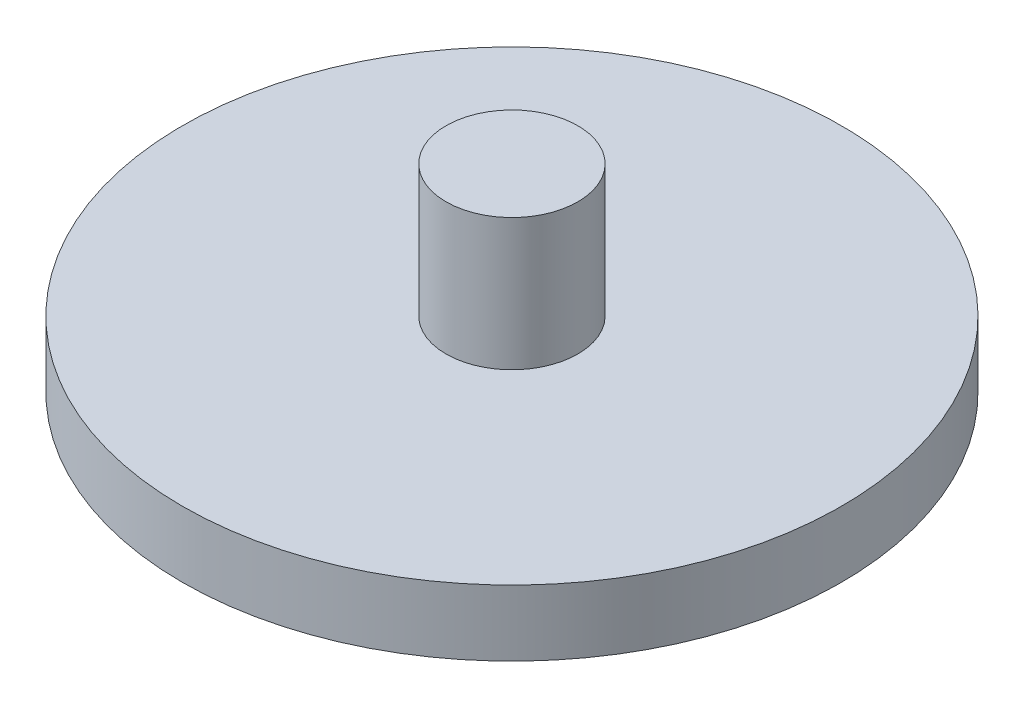
ISO-10303-21;
HEADER;
FILE_DESCRIPTION(('STEP AP214'),'2;1');
FILE_NAME('part.step','',(''),(''),'','','');
FILE_SCHEMA(('AUTOMOTIVE_DESIGN { 1 0 10303 214 1 1 1 1 }'));
ENDSEC;
DATA;
#1=APPLICATION_CONTEXT('core data for automotive mechanical design processes');
#2=APPLICATION_PROTOCOL_DEFINITION('international standard','automotive_design',2000,#1);
#3=PRODUCT_CONTEXT('',#1,'mechanical');
#4=PRODUCT('Part','Part','',(#3));
#5=PRODUCT_RELATED_PRODUCT_CATEGORY('part','',(#4));
#6=PRODUCT_DEFINITION_FORMATION('','',#4);
#7=PRODUCT_DEFINITION_CONTEXT('part definition',#1,'design');
#8=PRODUCT_DEFINITION('design','',#6,#7);
#9=PRODUCT_DEFINITION_SHAPE('','',#8);
#10=(LENGTH_UNIT() NAMED_UNIT(*) SI_UNIT(.MILLI.,.METRE.));
#11=(NAMED_UNIT(*) PLANE_ANGLE_UNIT() SI_UNIT($,.RADIAN.));
#12=(NAMED_UNIT(*) SI_UNIT($,.STERADIAN.) SOLID_ANGLE_UNIT());
#13=UNCERTAINTY_MEASURE_WITH_UNIT(LENGTH_MEASURE(1.E-05),#10,'distance_accuracy_value','');
#14=(GEOMETRIC_REPRESENTATION_CONTEXT(3) GLOBAL_UNCERTAINTY_ASSIGNED_CONTEXT((#13)) GLOBAL_UNIT_ASSIGNED_CONTEXT((#10,
#11,#12)) REPRESENTATION_CONTEXT('',''));
#15=CARTESIAN_POINT('',(0.,0.,0.));
#16=DIRECTION('',(0.,0.,1.));
#17=DIRECTION('',(1.,0.,0.));
#18=AXIS2_PLACEMENT_3D('',#15,#16,#17);
#19=CARTESIAN_POINT('',(0.,10.,0.));
#20=DIRECTION('',(0.,-1.,0.));
#21=DIRECTION('',(0.,0.,-1.));
#22=AXIS2_PLACEMENT_3D('',#19,#20,#21);
#23=CYLINDRICAL_SURFACE('',#22,50.);
#24=CARTESIAN_POINT('',(0.,10.,0.));
#25=DIRECTION('',(0.,1.,0.));
#26=DIRECTION('',(0.,0.,1.));
#27=AXIS2_PLACEMENT_3D('',#24,#25,#26);
#28=CIRCLE('',#27,50.);
#29=CARTESIAN_POINT('',(0.,10.,50.));
#30=VERTEX_POINT('',#29);
#31=EDGE_CURVE('E40',#30,#30,#28,.T.);
#32=ORIENTED_EDGE('',*,*,#31,.F.);
#33=EDGE_LOOP('',(#32));
#34=FACE_BOUND('',#33,.T.);
#35=CARTESIAN_POINT('',(0.,0.,0.));
#36=DIRECTION('',(0.,1.,0.));
#37=DIRECTION('',(0.,0.,1.));
#38=AXIS2_PLACEMENT_3D('',#35,#36,#37);
#39=CIRCLE('',#38,50.);
#40=CARTESIAN_POINT('',(0.,0.,50.));
#41=VERTEX_POINT('',#40);
#42=EDGE_CURVE('E36',#41,#41,#39,.T.);
#43=ORIENTED_EDGE('',*,*,#42,.T.);
#44=EDGE_LOOP('',(#43));
#45=FACE_BOUND('',#44,.T.);
#46=ADVANCED_FACE('F33',(#34,#45),#23,.T.);
#47=CARTESIAN_POINT('',(0.,10.,0.));
#48=DIRECTION('',(0.,1.,0.));
#49=DIRECTION('',(0.,0.,1.));
#50=AXIS2_PLACEMENT_3D('',#47,#48,#49);
#51=PLANE('',#50);
#52=CARTESIAN_POINT('',(0.,10.,0.));
#53=DIRECTION('',(0.,1.,0.));
#54=DIRECTION('',(0.,0.,1.));
#55=AXIS2_PLACEMENT_3D('',#52,#53,#54);
#56=CIRCLE('',#55,10.);
#57=CARTESIAN_POINT('',(0.,10.,10.));
#58=VERTEX_POINT('',#57);
#59=EDGE_CURVE('E10',#58,#58,#56,.T.);
#60=ORIENTED_EDGE('',*,*,#59,.F.);
#61=EDGE_LOOP('',(#60));
#62=FACE_BOUND('',#61,.T.);
#63=ORIENTED_EDGE('',*,*,#31,.T.);
#64=EDGE_LOOP('',(#63));
#65=FACE_BOUND('',#64,.T.);
#66=ADVANCED_FACE('F57',(#62,#65),#51,.T.);
#67=CARTESIAN_POINT('',(0.,0.,0.));
#68=DIRECTION('',(0.,1.,0.));
#69=DIRECTION('',(0.,0.,1.));
#70=AXIS2_PLACEMENT_3D('',#67,#68,#69);
#71=PLANE('',#70);
#72=ORIENTED_EDGE('',*,*,#42,.F.);
#73=EDGE_LOOP('',(#72));
#74=FACE_BOUND('',#73,.T.);
#75=ADVANCED_FACE('F54',(#74),#71,.F.);
#76=CARTESIAN_POINT('',(0.,30.,0.));
#77=DIRECTION('',(0.,-1.,0.));
#78=DIRECTION('',(0.,0.,-1.));
#79=AXIS2_PLACEMENT_3D('',#76,#77,#78);
#80=CYLINDRICAL_SURFACE('',#79,10.);
#81=CARTESIAN_POINT('',(0.,30.,0.));
#82=DIRECTION('',(0.,1.,0.));
#83=DIRECTION('',(0.,0.,1.));
#84=AXIS2_PLACEMENT_3D('',#81,#82,#83);
#85=CIRCLE('',#84,10.);
#86=CARTESIAN_POINT('',(0.,30.,10.));
#87=VERTEX_POINT('',#86);
#88=EDGE_CURVE('E46',#87,#87,#85,.T.);
#89=ORIENTED_EDGE('',*,*,#88,.F.);
#90=EDGE_LOOP('',(#89));
#91=FACE_BOUND('',#90,.T.);
#92=ORIENTED_EDGE('',*,*,#59,.T.);
#93=EDGE_LOOP('',(#92));
#94=FACE_BOUND('',#93,.T.);
#95=ADVANCED_FACE('F56',(#91,#94),#80,.T.);
#96=CARTESIAN_POINT('',(0.,30.,0.));
#97=DIRECTION('',(0.,1.,0.));
#98=DIRECTION('',(0.,0.,1.));
#99=AXIS2_PLACEMENT_3D('',#96,#97,#98);
#100=PLANE('',#99);
#101=ORIENTED_EDGE('',*,*,#88,.T.);
#102=EDGE_LOOP('',(#101));
#103=FACE_BOUND('',#102,.T.);
#104=ADVANCED_FACE('F62',(#103),#100,.T.);
#105=CLOSED_SHELL('',(#46,#66,#75,#95,#104));
#106=MANIFOLD_SOLID_BREP('B2',#105);
#107=ADVANCED_BREP_SHAPE_REPRESENTATION('',(#18,#106),#14);
#108=SHAPE_DEFINITION_REPRESENTATION(#9,#107);
ENDSEC;
END-ISO-10303-21;
